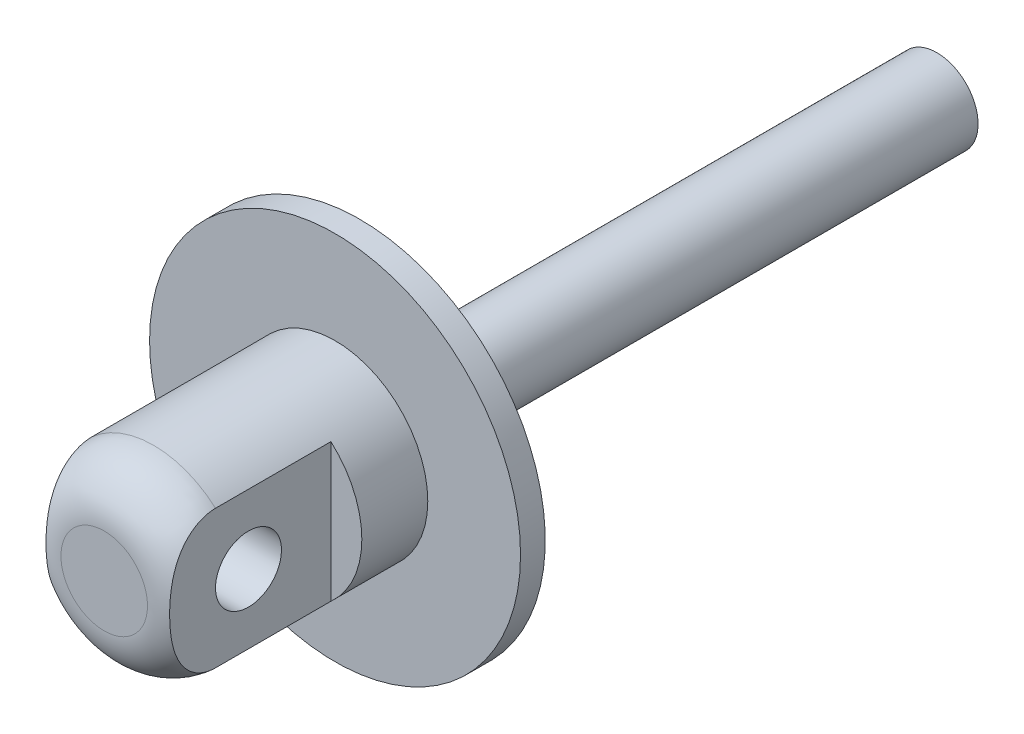
ISO-10303-21;
HEADER;
FILE_DESCRIPTION(('STEP AP214'),'2;1');
FILE_NAME('part.step','',(''),(''),'','','');
FILE_SCHEMA(('AUTOMOTIVE_DESIGN { 1 0 10303 214 1 1 1 1 }'));
ENDSEC;
DATA;
#1=APPLICATION_CONTEXT('core data for automotive mechanical design processes');
#2=APPLICATION_PROTOCOL_DEFINITION('international standard','automotive_design',2000,#1);
#3=PRODUCT_CONTEXT('',#1,'mechanical');
#4=PRODUCT('Part','Part','',(#3));
#5=PRODUCT_RELATED_PRODUCT_CATEGORY('part','',(#4));
#6=PRODUCT_DEFINITION_FORMATION('','',#4);
#7=PRODUCT_DEFINITION_CONTEXT('part definition',#1,'design');
#8=PRODUCT_DEFINITION('design','',#6,#7);
#9=PRODUCT_DEFINITION_SHAPE('','',#8);
#10=(LENGTH_UNIT() NAMED_UNIT(*) SI_UNIT(.MILLI.,.METRE.));
#11=(NAMED_UNIT(*) PLANE_ANGLE_UNIT() SI_UNIT($,.RADIAN.));
#12=(NAMED_UNIT(*) SI_UNIT($,.STERADIAN.) SOLID_ANGLE_UNIT());
#13=UNCERTAINTY_MEASURE_WITH_UNIT(LENGTH_MEASURE(1.E-05),#10,'distance_accuracy_value','');
#14=(GEOMETRIC_REPRESENTATION_CONTEXT(3) GLOBAL_UNCERTAINTY_ASSIGNED_CONTEXT((#13)) GLOBAL_UNIT_ASSIGNED_CONTEXT((#10,
#11,#12)) REPRESENTATION_CONTEXT('',''));
#15=CARTESIAN_POINT('',(0.,0.,0.));
#16=DIRECTION('',(0.,0.,1.));
#17=DIRECTION('',(1.,0.,0.));
#18=AXIS2_PLACEMENT_3D('',#15,#16,#17);
#19=CARTESIAN_POINT('',(0.,0.,101.));
#20=DIRECTION('',(0.,0.,-1.));
#21=DIRECTION('',(-1.,0.,0.));
#22=AXIS2_PLACEMENT_3D('',#19,#20,#21);
#23=CYLINDRICAL_SURFACE('',#22,22.5);
#24=CARTESIAN_POINT('',(0.,0.,70.));
#25=DIRECTION('',(0.,0.,-1.));
#26=DIRECTION('',(-1.,0.,0.));
#27=AXIS2_PLACEMENT_3D('',#24,#25,#26);
#28=CIRCLE('',#27,22.5);
#29=CARTESIAN_POINT('',(-22.5,0.,70.));
#30=VERTEX_POINT('',#29);
#31=EDGE_CURVE('E118',#30,#30,#28,.T.);
#32=ORIENTED_EDGE('',*,*,#31,.F.);
#33=EDGE_LOOP('',(#32));
#34=FACE_BOUND('',#33,.T.);
#35=CARTESIAN_POINT('',(0.,0.,73.));
#36=DIRECTION('',(0.,0.,1.));
#37=DIRECTION('',(1.,0.,0.));
#38=AXIS2_PLACEMENT_3D('',#35,#36,#37);
#39=CIRCLE('',#38,22.5);
#40=CARTESIAN_POINT('',(22.5,0.,73.));
#41=VERTEX_POINT('',#40);
#42=EDGE_CURVE('E111',#41,#41,#39,.T.);
#43=ORIENTED_EDGE('',*,*,#42,.F.);
#44=EDGE_LOOP('',(#43));
#45=FACE_BOUND('',#44,.T.);
#46=ADVANCED_FACE('F39',(#34,#45),#23,.T.);
#47=CARTESIAN_POINT('',(0.,0.,70.));
#48=DIRECTION('',(0.,0.,-1.));
#49=DIRECTION('',(-1.,0.,0.));
#50=AXIS2_PLACEMENT_3D('',#47,#48,#49);
#51=PLANE('',#50);
#52=CARTESIAN_POINT('',(0.,0.,70.));
#53=DIRECTION('',(0.,0.,-1.));
#54=DIRECTION('',(-1.,0.,0.));
#55=AXIS2_PLACEMENT_3D('',#52,#53,#54);
#56=CIRCLE('',#55,5.);
#57=CARTESIAN_POINT('',(-5.,0.,70.));
#58=VERTEX_POINT('',#57);
#59=EDGE_CURVE('E115',#58,#58,#56,.T.);
#60=ORIENTED_EDGE('',*,*,#59,.F.);
#61=EDGE_LOOP('',(#60));
#62=FACE_BOUND('',#61,.T.);
#63=ORIENTED_EDGE('',*,*,#31,.T.);
#64=EDGE_LOOP('',(#63));
#65=FACE_BOUND('',#64,.T.);
#66=ADVANCED_FACE('F155',(#62,#65),#51,.T.);
#67=CARTESIAN_POINT('',(0.,0.,70.));
#68=DIRECTION('',(0.,0.,-1.));
#69=DIRECTION('',(-1.,0.,0.));
#70=AXIS2_PLACEMENT_3D('',#67,#68,#69);
#71=CYLINDRICAL_SURFACE('',#70,5.);
#72=ORIENTED_EDGE('',*,*,#59,.T.);
#73=EDGE_LOOP('',(#72));
#74=FACE_BOUND('',#73,.T.);
#75=CARTESIAN_POINT('',(0.,0.,0.));
#76=DIRECTION('',(0.,0.,-1.));
#77=DIRECTION('',(-1.,0.,0.));
#78=AXIS2_PLACEMENT_3D('',#75,#76,#77);
#79=CIRCLE('',#78,5.);
#80=CARTESIAN_POINT('',(-5.,0.,0.));
#81=VERTEX_POINT('',#80);
#82=EDGE_CURVE('E114',#81,#81,#79,.T.);
#83=ORIENTED_EDGE('',*,*,#82,.F.);
#84=EDGE_LOOP('',(#83));
#85=FACE_BOUND('',#84,.T.);
#86=ADVANCED_FACE('F152',(#74,#85),#71,.T.);
#87=CARTESIAN_POINT('',(0.,0.,0.));
#88=DIRECTION('',(0.,0.,1.));
#89=DIRECTION('',(1.,0.,0.));
#90=AXIS2_PLACEMENT_3D('',#87,#88,#89);
#91=PLANE('',#90);
#92=ORIENTED_EDGE('',*,*,#82,.T.);
#93=EDGE_LOOP('',(#92));
#94=FACE_BOUND('',#93,.T.);
#95=ADVANCED_FACE('F150',(#94),#91,.F.);
#96=CARTESIAN_POINT('',(0.,0.,73.));
#97=DIRECTION('',(0.,0.,1.));
#98=DIRECTION('',(1.,0.,0.));
#99=AXIS2_PLACEMENT_3D('',#96,#97,#98);
#100=PLANE('',#99);
#101=CARTESIAN_POINT('',(0.,0.,73.));
#102=DIRECTION('',(0.,0.,1.));
#103=DIRECTION('',(1.,0.,0.));
#104=AXIS2_PLACEMENT_3D('',#101,#102,#103);
#105=CIRCLE('',#104,11.25);
#106=CARTESIAN_POINT('',(11.25,0.,73.));
#107=VERTEX_POINT('',#106);
#108=EDGE_CURVE('E108',#107,#107,#105,.T.);
#109=ORIENTED_EDGE('',*,*,#108,.F.);
#110=EDGE_LOOP('',(#109));
#111=FACE_BOUND('',#110,.T.);
#112=ORIENTED_EDGE('',*,*,#42,.T.);
#113=EDGE_LOOP('',(#112));
#114=FACE_BOUND('',#113,.T.);
#115=ADVANCED_FACE('F147',(#111,#114),#100,.T.);
#116=CARTESIAN_POINT('',(0.,0.,73.));
#117=DIRECTION('',(0.,0.,1.));
#118=DIRECTION('',(1.,0.,0.));
#119=AXIS2_PLACEMENT_3D('',#116,#117,#118);
#120=CYLINDRICAL_SURFACE('',#119,11.25);
#121=DIRECTION('',(0.,0.,1.));
#122=VECTOR('',#121,1.);
#123=CARTESIAN_POINT('',(-7.5,8.38525491562421,73.));
#124=LINE('',#123,#122);
#125=CARTESIAN_POINT('',(-7.5,8.3852549156243,94.9999999999999));
#126=VERTEX_POINT('',#125);
#127=CARTESIAN_POINT('',(-7.5,8.38525491562421,81.));
#128=VERTEX_POINT('',#127);
#129=EDGE_CURVE('E106',#126,#128,#124,.F.);
#130=ORIENTED_EDGE('',*,*,#129,.F.);
#131=CARTESIAN_POINT('',(0.,0.,95.));
#132=DIRECTION('',(0.,0.,1.));
#133=DIRECTION('',(1.,0.,0.));
#134=AXIS2_PLACEMENT_3D('',#131,#132,#133);
#135=CIRCLE('',#134,11.25);
#136=CARTESIAN_POINT('',(7.5,8.38525491562421,95.));
#137=VERTEX_POINT('',#136);
#138=EDGE_CURVE('E99',#126,#137,#135,.F.);
#139=ORIENTED_EDGE('',*,*,#138,.T.);
#140=DIRECTION('',(0.,0.,1.));
#141=VECTOR('',#140,1.);
#142=CARTESIAN_POINT('',(7.5,8.38525491562421,73.));
#143=LINE('',#142,#141);
#144=CARTESIAN_POINT('',(7.5,8.38525491562421,81.));
#145=VERTEX_POINT('',#144);
#146=EDGE_CURVE('E56',#145,#137,#143,.T.);
#147=ORIENTED_EDGE('',*,*,#146,.F.);
#148=CARTESIAN_POINT('',(0.,0.,81.));
#149=DIRECTION('',(0.,0.,-1.));
#150=DIRECTION('',(-1.,0.,0.));
#151=AXIS2_PLACEMENT_3D('',#148,#149,#150);
#152=CIRCLE('',#151,11.25);
#153=CARTESIAN_POINT('',(7.50000000000001,-8.38525491562421,81.));
#154=VERTEX_POINT('',#153);
#155=EDGE_CURVE('E49',#154,#145,#152,.F.);
#156=ORIENTED_EDGE('',*,*,#155,.F.);
#157=DIRECTION('',(0.,0.,1.));
#158=VECTOR('',#157,1.);
#159=CARTESIAN_POINT('',(7.50000000000001,-8.38525491562421,73.));
#160=LINE('',#159,#158);
#161=CARTESIAN_POINT('',(7.50000000000001,-8.3852549156243,94.9999999999999));
#162=VERTEX_POINT('',#161);
#163=EDGE_CURVE('E91',#162,#154,#160,.F.);
#164=ORIENTED_EDGE('',*,*,#163,.F.);
#165=CARTESIAN_POINT('',(-7.5,-8.38525491562421,95.));
#166=VERTEX_POINT('',#165);
#167=EDGE_CURVE('E126',#162,#166,#135,.F.);
#168=ORIENTED_EDGE('',*,*,#167,.T.);
#169=DIRECTION('',(0.,0.,1.));
#170=VECTOR('',#169,1.);
#171=CARTESIAN_POINT('',(-7.5,-8.38525491562421,73.));
#172=LINE('',#171,#170);
#173=CARTESIAN_POINT('',(-7.5,-8.38525491562421,81.));
#174=VERTEX_POINT('',#173);
#175=EDGE_CURVE('E64',#174,#166,#172,.T.);
#176=ORIENTED_EDGE('',*,*,#175,.F.);
#177=CARTESIAN_POINT('',(0.,0.,81.));
#178=DIRECTION('',(0.,0.,1.));
#179=DIRECTION('',(1.,0.,0.));
#180=AXIS2_PLACEMENT_3D('',#177,#178,#179);
#181=CIRCLE('',#180,11.25);
#182=EDGE_CURVE('E11',#174,#128,#181,.F.);
#183=ORIENTED_EDGE('',*,*,#182,.T.);
#184=EDGE_LOOP('',(#130,#139,#147,#156,#164,#168,#176,#183));
#185=FACE_BOUND('',#184,.T.);
#186=ORIENTED_EDGE('',*,*,#108,.T.);
#187=EDGE_LOOP('',(#186));
#188=FACE_BOUND('',#187,.T.);
#189=ADVANCED_FACE('F96',(#185,#188),#120,.T.);
#190=CARTESIAN_POINT('',(0.,0.,101.));
#191=DIRECTION('',(0.,0.,1.));
#192=DIRECTION('',(1.,0.,0.));
#193=AXIS2_PLACEMENT_3D('',#190,#191,#192);
#194=PLANE('',#193);
#195=CARTESIAN_POINT('',(0.,0.,101.));
#196=DIRECTION('',(0.,0.,1.));
#197=DIRECTION('',(1.,0.,0.));
#198=AXIS2_PLACEMENT_3D('',#195,#196,#197);
#199=CIRCLE('',#198,5.25);
#200=CARTESIAN_POINT('',(5.25,0.,101.));
#201=VERTEX_POINT('',#200);
#202=EDGE_CURVE('E123',#201,#201,#199,.T.);
#203=ORIENTED_EDGE('',*,*,#202,.T.);
#204=EDGE_LOOP('',(#203));
#205=FACE_BOUND('',#204,.T.);
#206=ADVANCED_FACE('F146',(#205),#194,.T.);
#207=CARTESIAN_POINT('',(0.,0.,95.));
#208=DIRECTION('',(0.,0.,1.));
#209=DIRECTION('',(1.,0.,0.));
#210=AXIS2_PLACEMENT_3D('',#207,#208,#209);
#211=DEGENERATE_TOROIDAL_SURFACE('',#210,5.25,6.,.T.);
#212=CARTESIAN_POINT('',(-7.5,0.,100.562148865322));
#213=CARTESIAN_POINT('',(-7.5,0.164189019990902,100.562145614841));
#214=CARTESIAN_POINT('',(-7.5,0.328372486423925,100.559973378696));
#215=CARTESIAN_POINT('',(-7.5,0.656627265334217,100.551201269905));
#216=CARTESIAN_POINT('',(-7.5,0.820698575998209,100.544601327293));
#217=CARTESIAN_POINT('',(-7.5,1.1486468262588,100.52675380707));
#218=CARTESIAN_POINT('',(-7.5,1.31252368567589,100.515504724629));
#219=CARTESIAN_POINT('',(-7.5,1.6398554572701,100.487997481592));
#220=CARTESIAN_POINT('',(-7.5,1.80331035213332,100.471739118651));
#221=CARTESIAN_POINT('',(-7.5,2.29175938686725,100.41487160018));
#222=CARTESIAN_POINT('',(-7.5,2.61588264756811,100.366118755556));
#223=CARTESIAN_POINT('',(-7.5,3.2588173179616,100.242126366605));
#224=CARTESIAN_POINT('',(-7.5,3.57763302000548,100.166909435147));
#225=CARTESIAN_POINT('',(-7.5,4.23603998930151,99.9756958219862));
#226=CARTESIAN_POINT('',(-7.5,4.57475444049857,99.8565218767773));
#227=CARTESIAN_POINT('',(-7.5,5.06829960048401,99.6439615522642));
#228=CARTESIAN_POINT('',(-7.5,5.23046687048265,99.5674306444914));
#229=CARTESIAN_POINT('',(-7.5,5.54859002345835,99.4024492770321));
#230=CARTESIAN_POINT('',(-7.5,5.70454845959773,99.3140037837778));
#231=CARTESIAN_POINT('',(-7.5,6.01062237816506,99.123551285862));
#232=CARTESIAN_POINT('',(-7.5,6.1606439768984,99.0213927208312));
#233=CARTESIAN_POINT('',(-7.5,6.45096958294488,98.8041915397136));
#234=CARTESIAN_POINT('',(-7.5,6.59127866439164,98.6891557345938));
#235=CARTESIAN_POINT('',(-7.5,6.86023271353424,98.4463537359576));
#236=CARTESIAN_POINT('',(-7.5,6.98888870499407,98.3185998190833));
#237=CARTESIAN_POINT('',(-7.5,7.23263129233829,98.0508394234999));
#238=CARTESIAN_POINT('',(-7.5,7.3477227409073,97.9108373579588));
#239=CARTESIAN_POINT('',(-7.5,7.61419073399971,97.5490216958382));
#240=CARTESIAN_POINT('',(-7.5,7.75635391307374,97.3202753636124));
#241=CARTESIAN_POINT('',(-7.5,8.00042456502334,96.8422986176253));
#242=CARTESIAN_POINT('',(-7.5,8.10235096650471,96.59307790246));
#243=CARTESIAN_POINT('',(-7.5,8.26149810334816,96.0797413983651));
#244=CARTESIAN_POINT('',(-7.5,8.3185715971506,95.8155795779201));
#245=CARTESIAN_POINT('',(-7.5,8.38448085212744,95.281284023902));
#246=CARTESIAN_POINT('',(-7.5,8.39332234387718,95.0111510036128));
#247=CARTESIAN_POINT('',(-7.5,8.36324587269025,94.4893700901679));
#248=CARTESIAN_POINT('',(-7.5,8.32706956757516,94.237559159166));
#249=CARTESIAN_POINT('',(-7.5,8.21325096456949,93.7435702336642));
#250=CARTESIAN_POINT('',(-7.5,8.13561404859865,93.5013909932767));
#251=CARTESIAN_POINT('',(-7.5,7.9414965888607,93.03087787684));
#252=CARTESIAN_POINT('',(-7.5,7.82469916673477,92.802675517634));
#253=CARTESIAN_POINT('',(-7.5,7.55722088662209,92.3671407243551));
#254=CARTESIAN_POINT('',(-7.5,7.40652904224299,92.1598150887886));
#255=CARTESIAN_POINT('',(-7.5,7.06307249767575,91.7530542355968));
#256=CARTESIAN_POINT('',(-7.5,6.86785441427993,91.5557008311617));
#257=CARTESIAN_POINT('',(-7.5,6.4512427847553,91.1910997423688));
#258=CARTESIAN_POINT('',(-7.5,6.22984389446749,91.0238582222374));
#259=CARTESIAN_POINT('',(-7.5,5.82331385872649,90.7560507199056));
#260=CARTESIAN_POINT('',(-7.5,5.64229678382582,90.6491286037174));
#261=CARTESIAN_POINT('',(-7.5,5.27146176582727,90.451759601475));
#262=CARTESIAN_POINT('',(-7.5,5.08163995761043,90.3613200384958));
#263=CARTESIAN_POINT('',(-7.5,4.50148763865432,90.1129088864335));
#264=CARTESIAN_POINT('',(-7.5,4.101044671332,89.9782080049966));
#265=CARTESIAN_POINT('',(-7.5,3.51747406042826,89.8218494328596));
#266=CARTESIAN_POINT('',(-7.5,3.33935657065318,89.7793158856219));
#267=CARTESIAN_POINT('',(-7.5,2.98126481383961,89.702942430861));
#268=CARTESIAN_POINT('',(-7.5,2.8012910121565,89.6691003970488));
#269=CARTESIAN_POINT('',(-7.5,2.43989070916085,89.6091739481793));
#270=CARTESIAN_POINT('',(-7.5,2.25846286588919,89.583097825792));
#271=CARTESIAN_POINT('',(-7.5,1.89474907005483,89.5379178002149));
#272=CARTESIAN_POINT('',(-7.5,1.71246312770429,89.5188138142619));
#273=CARTESIAN_POINT('',(-7.5,1.34665130820012,89.4868325322415));
#274=CARTESIAN_POINT('',(-7.5,1.16312335533482,89.4739793361326));
#275=CARTESIAN_POINT('',(-7.5,0.795759438953638,89.4540977109543));
#276=CARTESIAN_POINT('',(-7.5,0.611923479920832,89.447069197831));
#277=CARTESIAN_POINT('',(-7.5,0.244209121419214,89.438539504482));
#278=CARTESIAN_POINT('',(-7.5,0.0603307812320591,89.4370357608242));
#279=CARTESIAN_POINT('',(-7.5,-0.30738625869008,89.4394896839592));
#280=CARTESIAN_POINT('',(-7.5,-0.491224957989974,89.4434474079203));
#281=CARTESIAN_POINT('',(-7.5,-0.981357235268532,89.4614833442288));
#282=CARTESIAN_POINT('',(-7.5,-1.28748810610653,89.4805532342397));
#283=CARTESIAN_POINT('',(-7.5,-1.89823798661537,89.5364147775158));
#284=CARTESIAN_POINT('',(-7.5,-2.2028567022061,89.5732097512393));
#285=CARTESIAN_POINT('',(-7.5,-2.80729870680781,89.6678404964301));
#286=CARTESIAN_POINT('',(-7.5,-3.10713855762887,89.7255676431236));
#287=CARTESIAN_POINT('',(-7.5,-3.70089132219802,89.8664035783026));
#288=CARTESIAN_POINT('',(-7.5,-3.99480647444011,89.9495025815366));
#289=CARTESIAN_POINT('',(-7.5,-4.45627191526443,90.1060285377643));
#290=CARTESIAN_POINT('',(-7.5,-4.62708140273487,90.169892906979));
#291=CARTESIAN_POINT('',(-7.5,-4.96390677483259,90.3090944790512));
#292=CARTESIAN_POINT('',(-7.5,-5.12992492179648,90.3844261583363));
#293=CARTESIAN_POINT('',(-7.5,-5.45588484955697,90.547313708139));
#294=CARTESIAN_POINT('',(-7.5,-5.61582650951974,90.6348698215835));
#295=CARTESIAN_POINT('',(-7.5,-5.92805066036049,90.8227408486685));
#296=CARTESIAN_POINT('',(-7.5,-6.08033434129721,90.9230537712827));
#297=CARTESIAN_POINT('',(-7.5,-6.35190448750724,91.1196413537591));
#298=CARTESIAN_POINT('',(-7.5,-6.47257668212401,91.214002410334));
#299=CARTESIAN_POINT('',(-7.5,-6.70613029678767,91.4119061205593));
#300=CARTESIAN_POINT('',(-7.5,-6.81901328855409,91.5154469122149));
#301=CARTESIAN_POINT('',(-7.5,-7.03585423461626,91.7315646855056));
#302=CARTESIAN_POINT('',(-7.5,-7.13980980521249,91.8441440650927));
#303=CARTESIAN_POINT('',(-7.5,-7.33750434441383,92.0778656870145));
#304=CARTESIAN_POINT('',(-7.5,-7.43124845856967,92.1990035655138));
#305=CARTESIAN_POINT('',(-7.5,-7.60809458697087,92.4502926252514));
#306=CARTESIAN_POINT('',(-7.5,-7.69110513834616,92.5805083501799));
#307=CARTESIAN_POINT('',(-7.5,-7.84439292776033,92.8481645254083));
#308=CARTESIAN_POINT('',(-7.5,-7.91467628509888,92.9856014624829));
#309=CARTESIAN_POINT('',(-7.5,-8.04149015511168,93.2666529243603));
#310=CARTESIAN_POINT('',(-7.5,-8.09802394213057,93.4102659687693));
#311=CARTESIAN_POINT('',(-7.5,-8.19645791501223,93.7024179281931));
#312=CARTESIAN_POINT('',(-7.5,-8.23836030248015,93.8509560984318));
#313=CARTESIAN_POINT('',(-7.5,-8.30239786558441,94.1319759501696));
#314=CARTESIAN_POINT('',(-7.5,-8.32639393107285,94.2640364519176));
#315=CARTESIAN_POINT('',(-7.5,-8.36248935332499,94.5297700111308));
#316=CARTESIAN_POINT('',(-7.5,-8.37458977568818,94.6634429230719));
#317=CARTESIAN_POINT('',(-7.5,-8.38673463892912,94.9312832658235));
#318=CARTESIAN_POINT('',(-7.5,-8.38678364856389,95.0654504899471));
#319=CARTESIAN_POINT('',(-7.5,-8.37483656628666,95.3332469683191));
#320=CARTESIAN_POINT('',(-7.5,-8.36284069553736,95.4668762324));
#321=CARTESIAN_POINT('',(-7.5,-8.32802023381419,95.7246941099316));
#322=CARTESIAN_POINT('',(-7.5,-8.30587511432108,95.8489751672492));
#323=CARTESIAN_POINT('',(-7.5,-8.25130222454112,96.0952993095888));
#324=CARTESIAN_POINT('',(-7.5,-8.21887115866612,96.2173416640614));
#325=CARTESIAN_POINT('',(-7.5,-8.14410537660234,96.4582911329761));
#326=CARTESIAN_POINT('',(-7.5,-8.10177496586484,96.5771995854783));
#327=CARTESIAN_POINT('',(-7.5,-8.00764302829837,96.8112505050002));
#328=CARTESIAN_POINT('',(-7.5,-7.95583793827506,96.9263915359149));
#329=CARTESIAN_POINT('',(-7.5,-7.84191083493718,97.1550023322007));
#330=CARTESIAN_POINT('',(-7.5,-7.77956635069223,97.2683612820949));
#331=CARTESIAN_POINT('',(-7.5,-7.64614360676528,97.489835538695));
#332=CARTESIAN_POINT('',(-7.5,-7.57506220944211,97.5979489420409));
#333=CARTESIAN_POINT('',(-7.5,-7.34975166829239,97.9136137357989));
#334=CARTESIAN_POINT('',(-7.5,-7.18337949184802,98.1126415190447));
#335=CARTESIAN_POINT('',(-7.5,-6.80636458848373,98.503604234048));
#336=CARTESIAN_POINT('',(-7.5,-6.59295990059606,98.6928454416478));
#337=CARTESIAN_POINT('',(-7.5,-6.14172838846501,99.0394432038326));
#338=CARTESIAN_POINT('',(-7.5,-5.90389080322802,99.1967856177154));
#339=CARTESIAN_POINT('',(-7.5,-5.46061010462404,99.4517929978391));
#340=CARTESIAN_POINT('',(-7.5,-5.25834812589983,99.5550913676247));
#341=CARTESIAN_POINT('',(-7.5,-4.84539479890681,99.7432987825237));
#342=CARTESIAN_POINT('',(-7.5,-4.63469910535659,99.828198199669));
#343=CARTESIAN_POINT('',(-7.5,-3.99291486191668,100.057846137754));
#344=CARTESIAN_POINT('',(-7.5,-3.5526686119709,100.177249467179));
#345=CARTESIAN_POINT('',(-7.5,-2.85253385670755,100.323127880758));
#346=CARTESIAN_POINT('',(-7.5,-2.59593311647367,100.36751120686));
#347=CARTESIAN_POINT('',(-7.5,-2.08052396663202,100.441479993355));
#348=CARTESIAN_POINT('',(-7.5,-1.82171525699367,100.471063409002));
#349=CARTESIAN_POINT('',(-7.5,-1.30266273387959,100.517518327467));
#350=CARTESIAN_POINT('',(-7.5,-1.0424174503302,100.534372539342));
#351=CARTESIAN_POINT('',(-7.5,-0.5214434381434,100.55669029351));
#352=CARTESIAN_POINT('',(-7.5,-0.260714717683116,100.562154026739));
#353=CARTESIAN_POINT('',(-7.5,0.,100.562148865322));
#354=B_SPLINE_CURVE_WITH_KNOTS('',3,(#212,#213,#214,#215,#216,#217,#218,#219,#220,#221,#222,
#223,#224,#225,#226,#227,#228,#229,#230,#231,#232,#233,#234,#235,#236,#237,#238,#239,#240,#241,
#242,#243,#244,#245,#246,#247,#248,#249,#250,#251,#252,#253,#254,#255,#256,#257,#258,#259,#260,
#261,#262,#263,#264,#265,#266,#267,#268,#269,#270,#271,#272,#273,#274,#275,#276,#277,#278,#279,
#280,#281,#282,#283,#284,#285,#286,#287,#288,#289,#290,#291,#292,#293,#294,#295,#296,#297,#298,
#299,#300,#301,#302,#303,#304,#305,#306,#307,#308,#309,#310,#311,#312,#313,#314,#315,#316,#317,
#318,#319,#320,#321,#322,#323,#324,#325,#326,#327,#328,#329,#330,#331,#332,#333,#334,#335,#336,
#337,#338,#339,#340,#341,#342,#343,#344,#345,#346,#347,#348,#349,#350,#351,#352,#353),
.UNSPECIFIED.,.T.,.F.,(4,2,2,2,2,2,2,2,2,2,2,2,2,2,2,2,2,2,2,2,2,2,2,2,2,2,2,2,2,2,2,2,2,2,2,2,
2,2,2,2,2,2,2,2,2,2,2,2,2,2,2,2,2,2,2,2,2,2,2,2,2,2,2,2,2,2,2,2,2,2,4),(0.,0.492542286291293,
0.985092355825993,1.47780197837868,1.97053150611185,2.95285793120435,3.93434701448376,
5.00841262192395,5.54595445732028,6.08327291510475,6.62711247397602,7.170665734995,
7.71369930640121,8.25653801526729,9.06076505818721,9.86461331606715,10.6710895224737,
11.4774699071615,12.2370568970641,12.9965453104436,13.7623339316142,14.5283711308394,
15.3579648282033,16.1877281597057,16.8175712115457,17.4476934193512,18.7099516483037,
19.2592384907188,19.8083908275161,20.3581274800225,20.9078576066199,21.4596907413379,
22.0115159126171,22.5630850107359,23.1146598824899,24.0343699669765,24.9542524087416,
25.8694280017348,26.7842510806898,27.3309693822784,27.8774251691246,28.42389181682,
28.9702732788648,29.4293952010926,29.8884242083012,30.3475754016437,30.8064941479401,
31.269096580042,31.7314759965319,32.1937451931943,32.6559448016227,33.058094773878,
33.4602087186688,33.8621702196108,34.264124340051,34.6424019290925,35.0208008398476,
35.3990354813382,35.7774126611877,36.1650991367167,36.5529252490647,37.3280727460442,
38.1806384362803,39.0335812455535,39.7139608424498,40.3946956193241,41.75798709509,
42.5389380884001,43.3199969475708,44.1021148732969,44.8842196883725),.UNSPECIFIED.);
#355=EDGE_CURVE('E88',#166,#126,#354,.T.);
#356=ORIENTED_EDGE('',*,*,#355,.F.);
#357=ORIENTED_EDGE('',*,*,#167,.F.);
#358=CARTESIAN_POINT('',(7.5,0.,100.562148865322));
#359=CARTESIAN_POINT('',(7.5,-0.164189019990903,100.562145614841));
#360=CARTESIAN_POINT('',(7.5,-0.328372486423926,100.559973378696));
#361=CARTESIAN_POINT('',(7.5,-0.656627265334218,100.551201269905));
#362=CARTESIAN_POINT('',(7.5,-0.820698575998211,100.544601327293));
#363=CARTESIAN_POINT('',(7.5,-1.1486468262588,100.52675380707));
#364=CARTESIAN_POINT('',(7.5,-1.31252368567589,100.515504724629));
#365=CARTESIAN_POINT('',(7.5,-1.6398554572701,100.487997481592));
#366=CARTESIAN_POINT('',(7.5,-1.80331035213333,100.471739118651));
#367=CARTESIAN_POINT('',(7.5,-2.29175938686726,100.41487160018));
#368=CARTESIAN_POINT('',(7.5,-2.61588264756811,100.366118755556));
#369=CARTESIAN_POINT('',(7.5,-3.2588173179616,100.242126366605));
#370=CARTESIAN_POINT('',(7.5,-3.57763302000549,100.166909435147));
#371=CARTESIAN_POINT('',(7.5,-4.23603998930151,99.9756958219862));
#372=CARTESIAN_POINT('',(7.50000000000001,-4.57475444049857,99.8565218767773));
#373=CARTESIAN_POINT('',(7.50000000000001,-5.06829960048402,99.6439615522642));
#374=CARTESIAN_POINT('',(7.50000000000001,-5.23046687048266,99.5674306444914));
#375=CARTESIAN_POINT('',(7.50000000000001,-5.54859002345837,99.4024492770321));
#376=CARTESIAN_POINT('',(7.50000000000001,-5.70454845959774,99.3140037837778));
#377=CARTESIAN_POINT('',(7.50000000000001,-6.01062237816507,99.1235512858619));
#378=CARTESIAN_POINT('',(7.50000000000001,-6.16064397689841,99.0213927208312));
#379=CARTESIAN_POINT('',(7.50000000000001,-6.45096958294489,98.8041915397136));
#380=CARTESIAN_POINT('',(7.50000000000001,-6.59127866439165,98.6891557345938));
#381=CARTESIAN_POINT('',(7.50000000000001,-6.86023271353425,98.4463537359576));
#382=CARTESIAN_POINT('',(7.50000000000001,-6.98888870499408,98.3185998190833));
#383=CARTESIAN_POINT('',(7.50000000000001,-7.23263129233829,98.0508394234999));
#384=CARTESIAN_POINT('',(7.50000000000001,-7.34772274090731,97.9108373579588));
#385=CARTESIAN_POINT('',(7.50000000000001,-7.61419073399972,97.5490216958382));
#386=CARTESIAN_POINT('',(7.50000000000001,-7.75635391307375,97.3202753636124));
#387=CARTESIAN_POINT('',(7.50000000000001,-8.00042456502334,96.8422986176253));
#388=CARTESIAN_POINT('',(7.50000000000001,-8.1023509665047,96.59307790246));
#389=CARTESIAN_POINT('',(7.50000000000001,-8.26149810334816,96.0797413983651));
#390=CARTESIAN_POINT('',(7.50000000000001,-8.3185715971506,95.8155795779201));
#391=CARTESIAN_POINT('',(7.50000000000001,-8.38448085212744,95.281284023902));
#392=CARTESIAN_POINT('',(7.50000000000001,-8.39332234387718,95.0111510036128));
#393=CARTESIAN_POINT('',(7.50000000000001,-8.36324587269025,94.4893700901679));
#394=CARTESIAN_POINT('',(7.50000000000001,-8.32706956757515,94.2375591591661));
#395=CARTESIAN_POINT('',(7.50000000000001,-8.21325096456949,93.7435702336642));
#396=CARTESIAN_POINT('',(7.50000000000001,-8.13561404859865,93.5013909932767));
#397=CARTESIAN_POINT('',(7.50000000000001,-7.94149658886069,93.03087787684));
#398=CARTESIAN_POINT('',(7.50000000000001,-7.82469916673477,92.802675517634));
#399=CARTESIAN_POINT('',(7.50000000000001,-7.55722088662208,92.3671407243551));
#400=CARTESIAN_POINT('',(7.50000000000001,-7.40652904224298,92.1598150887886));
#401=CARTESIAN_POINT('',(7.50000000000001,-7.06307249767574,91.7530542355968));
#402=CARTESIAN_POINT('',(7.50000000000001,-6.86785441427992,91.5557008311617));
#403=CARTESIAN_POINT('',(7.50000000000001,-6.4512427847553,91.1910997423688));
#404=CARTESIAN_POINT('',(7.50000000000001,-6.22984389446748,91.0238582222374));
#405=CARTESIAN_POINT('',(7.50000000000001,-5.82331385872649,90.7560507199056));
#406=CARTESIAN_POINT('',(7.50000000000001,-5.64229678382581,90.6491286037174));
#407=CARTESIAN_POINT('',(7.50000000000001,-5.27146176582725,90.451759601475));
#408=CARTESIAN_POINT('',(7.50000000000001,-5.08163995761042,90.3613200384958));
#409=CARTESIAN_POINT('',(7.50000000000001,-4.50148763865431,90.1129088864335));
#410=CARTESIAN_POINT('',(7.5,-4.10104467133199,89.9782080049966));
#411=CARTESIAN_POINT('',(7.5,-3.51747406042825,89.8218494328596));
#412=CARTESIAN_POINT('',(7.5,-3.33935657065318,89.7793158856219));
#413=CARTESIAN_POINT('',(7.5,-2.9812648138396,89.702942430861));
#414=CARTESIAN_POINT('',(7.5,-2.80129101215649,89.6691003970488));
#415=CARTESIAN_POINT('',(7.5,-2.43989070916084,89.6091739481793));
#416=CARTESIAN_POINT('',(7.5,-2.25846286588918,89.583097825792));
#417=CARTESIAN_POINT('',(7.5,-1.89474907005482,89.537917800215));
#418=CARTESIAN_POINT('',(7.5,-1.71246312770428,89.5188138142619));
#419=CARTESIAN_POINT('',(7.5,-1.34665130820011,89.4868325322415));
#420=CARTESIAN_POINT('',(7.5,-1.16312335533481,89.4739793361326));
#421=CARTESIAN_POINT('',(7.5,-0.795759438953623,89.4540977109543));
#422=CARTESIAN_POINT('',(7.5,-0.611923479920817,89.447069197831));
#423=CARTESIAN_POINT('',(7.5,-0.244209121419201,89.438539504482));
#424=CARTESIAN_POINT('',(7.5,-0.0603307812320454,89.4370357608242));
#425=CARTESIAN_POINT('',(7.5,0.307386258690094,89.4394896839592));
#426=CARTESIAN_POINT('',(7.5,0.491224957989988,89.4434474079203));
#427=CARTESIAN_POINT('',(7.5,0.981357235268542,89.4614833442287));
#428=CARTESIAN_POINT('',(7.5,1.28748810610654,89.4805532342397));
#429=CARTESIAN_POINT('',(7.5,1.89823798661538,89.5364147775158));
#430=CARTESIAN_POINT('',(7.5,2.20285670220611,89.5732097512393));
#431=CARTESIAN_POINT('',(7.5,2.80729870680781,89.6678404964301));
#432=CARTESIAN_POINT('',(7.5,3.10713855762887,89.7255676431236));
#433=CARTESIAN_POINT('',(7.5,3.70089132219801,89.8664035783026));
#434=CARTESIAN_POINT('',(7.5,3.99480647444011,89.9495025815366));
#435=CARTESIAN_POINT('',(7.5,4.45627191526443,90.1060285377643));
#436=CARTESIAN_POINT('',(7.5,4.62708140273487,90.169892906979));
#437=CARTESIAN_POINT('',(7.5,4.96390677483259,90.3090944790512));
#438=CARTESIAN_POINT('',(7.5,5.12992492179649,90.3844261583363));
#439=CARTESIAN_POINT('',(7.5,5.45588484955697,90.547313708139));
#440=CARTESIAN_POINT('',(7.5,5.61582650951974,90.6348698215835));
#441=CARTESIAN_POINT('',(7.5,5.92805066036049,90.8227408486685));
#442=CARTESIAN_POINT('',(7.5,6.08033434129721,90.9230537712827));
#443=CARTESIAN_POINT('',(7.5,6.35190448750724,91.1196413537591));
#444=CARTESIAN_POINT('',(7.5,6.472576682124,91.214002410334));
#445=CARTESIAN_POINT('',(7.5,6.70613029678767,91.4119061205593));
#446=CARTESIAN_POINT('',(7.5,6.81901328855408,91.5154469122149));
#447=CARTESIAN_POINT('',(7.5,7.03585423461625,91.7315646855056));
#448=CARTESIAN_POINT('',(7.5,7.13980980521248,91.8441440650927));
#449=CARTESIAN_POINT('',(7.5,7.33750434441383,92.0778656870145));
#450=CARTESIAN_POINT('',(7.5,7.43124845856967,92.1990035655138));
#451=CARTESIAN_POINT('',(7.5,7.60809458697086,92.4502926252514));
#452=CARTESIAN_POINT('',(7.5,7.69110513834616,92.5805083501799));
#453=CARTESIAN_POINT('',(7.5,7.84439292776032,92.8481645254083));
#454=CARTESIAN_POINT('',(7.5,7.91467628509888,92.9856014624829));
#455=CARTESIAN_POINT('',(7.5,8.04149015511168,93.2666529243603));
#456=CARTESIAN_POINT('',(7.5,8.09802394213057,93.4102659687693));
#457=CARTESIAN_POINT('',(7.5,8.19645791501223,93.7024179281931));
#458=CARTESIAN_POINT('',(7.5,8.23836030248015,93.8509560984318));
#459=CARTESIAN_POINT('',(7.5,8.30239786558441,94.1319759501696));
#460=CARTESIAN_POINT('',(7.5,8.32639393107285,94.2640364519176));
#461=CARTESIAN_POINT('',(7.5,8.36248935332499,94.5297700111308));
#462=CARTESIAN_POINT('',(7.5,8.37458977568818,94.6634429230719));
#463=CARTESIAN_POINT('',(7.5,8.38673463892912,94.9312832658235));
#464=CARTESIAN_POINT('',(7.5,8.38678364856389,95.0654504899471));
#465=CARTESIAN_POINT('',(7.5,8.37483656628666,95.3332469683191));
#466=CARTESIAN_POINT('',(7.5,8.36284069553736,95.4668762324));
#467=CARTESIAN_POINT('',(7.5,8.32802023381419,95.7246941099316));
#468=CARTESIAN_POINT('',(7.5,8.30587511432108,95.8489751672492));
#469=CARTESIAN_POINT('',(7.5,8.25130222454112,96.0952993095888));
#470=CARTESIAN_POINT('',(7.5,8.21887115866612,96.2173416640614));
#471=CARTESIAN_POINT('',(7.5,8.14410537660233,96.4582911329761));
#472=CARTESIAN_POINT('',(7.5,8.10177496586484,96.5771995854783));
#473=CARTESIAN_POINT('',(7.5,8.00764302829837,96.8112505050002));
#474=CARTESIAN_POINT('',(7.5,7.95583793827506,96.9263915359149));
#475=CARTESIAN_POINT('',(7.5,7.84191083493718,97.1550023322007));
#476=CARTESIAN_POINT('',(7.5,7.77956635069222,97.2683612820949));
#477=CARTESIAN_POINT('',(7.5,7.64614360676527,97.4898355386951));
#478=CARTESIAN_POINT('',(7.5,7.5750622094421,97.5979489420409));
#479=CARTESIAN_POINT('',(7.5,7.34975166829239,97.9136137357989));
#480=CARTESIAN_POINT('',(7.5,7.18337949184801,98.1126415190447));
#481=CARTESIAN_POINT('',(7.5,6.80636458848373,98.503604234048));
#482=CARTESIAN_POINT('',(7.5,6.59295990059606,98.6928454416478));
#483=CARTESIAN_POINT('',(7.5,6.141728388465,99.0394432038326));
#484=CARTESIAN_POINT('',(7.5,5.90389080322802,99.1967856177154));
#485=CARTESIAN_POINT('',(7.5,5.46061010462404,99.4517929978391));
#486=CARTESIAN_POINT('',(7.5,5.25834812589983,99.5550913676247));
#487=CARTESIAN_POINT('',(7.5,4.84539479890681,99.7432987825237));
#488=CARTESIAN_POINT('',(7.5,4.63469910535659,99.828198199669));
#489=CARTESIAN_POINT('',(7.5,3.99291486191668,100.057846137754));
#490=CARTESIAN_POINT('',(7.5,3.5526686119709,100.177249467179));
#491=CARTESIAN_POINT('',(7.5,2.85253385670755,100.323127880758));
#492=CARTESIAN_POINT('',(7.5,2.59593311647367,100.36751120686));
#493=CARTESIAN_POINT('',(7.5,2.08052396663203,100.441479993355));
#494=CARTESIAN_POINT('',(7.5,1.82171525699367,100.471063409002));
#495=CARTESIAN_POINT('',(7.5,1.30266273387959,100.517518327467));
#496=CARTESIAN_POINT('',(7.5,1.0424174503302,100.534372539342));
#497=CARTESIAN_POINT('',(7.5,0.5214434381434,100.55669029351));
#498=CARTESIAN_POINT('',(7.5,0.260714717683115,100.562154026739));
#499=CARTESIAN_POINT('',(7.5,0.,100.562148865322));
#500=B_SPLINE_CURVE_WITH_KNOTS('',3,(#358,#359,#360,#361,#362,#363,#364,#365,#366,#367,#368,
#369,#370,#371,#372,#373,#374,#375,#376,#377,#378,#379,#380,#381,#382,#383,#384,#385,#386,#387,
#388,#389,#390,#391,#392,#393,#394,#395,#396,#397,#398,#399,#400,#401,#402,#403,#404,#405,#406,
#407,#408,#409,#410,#411,#412,#413,#414,#415,#416,#417,#418,#419,#420,#421,#422,#423,#424,#425,
#426,#427,#428,#429,#430,#431,#432,#433,#434,#435,#436,#437,#438,#439,#440,#441,#442,#443,#444,
#445,#446,#447,#448,#449,#450,#451,#452,#453,#454,#455,#456,#457,#458,#459,#460,#461,#462,#463,
#464,#465,#466,#467,#468,#469,#470,#471,#472,#473,#474,#475,#476,#477,#478,#479,#480,#481,#482,
#483,#484,#485,#486,#487,#488,#489,#490,#491,#492,#493,#494,#495,#496,#497,#498,#499),
.UNSPECIFIED.,.T.,.F.,(4,2,2,2,2,2,2,2,2,2,2,2,2,2,2,2,2,2,2,2,2,2,2,2,2,2,2,2,2,2,2,2,2,2,2,2,
2,2,2,2,2,2,2,2,2,2,2,2,2,2,2,2,2,2,2,2,2,2,2,2,2,2,2,2,2,2,2,2,2,2,4),(0.,0.492542286291294,
0.985092355825994,1.47780197837868,1.97053150611185,2.95285793120436,3.93434701448376,
5.00841262192396,5.5459544573203,6.08327291510476,6.62711247397602,7.17066573499501,
7.71369930640121,8.2565380152673,9.06076505818723,9.86461331606715,10.6710895224737,
11.4774699071615,12.2370568970641,12.9965453104436,13.7623339316142,14.5283711308394,
15.3579648282033,16.1877281597056,16.8175712115457,17.4476934193512,18.7099516483037,
19.2592384907188,19.8083908275161,20.3581274800225,20.9078576066199,21.4596907413379,
22.0115159126172,22.5630850107359,23.1146598824899,24.0343699669765,24.9542524087416,
25.8694280017348,26.7842510806898,27.3309693822784,27.8774251691246,28.42389181682,
28.9702732788648,29.4293952010926,29.8884242083011,30.3475754016436,30.8064941479401,
31.2690965800419,31.7314759965319,32.1937451931943,32.6559448016227,33.058094773878,
33.4602087186688,33.8621702196108,34.2641243400509,34.6424019290925,35.0208008398476,
35.3990354813382,35.7774126611877,36.1650991367167,36.5529252490647,37.3280727460442,
38.1806384362803,39.0335812455535,39.7139608424498,40.394695619324,41.75798709509,
42.5389380884001,43.3199969475708,44.1021148732969,44.8842196883725),.UNSPECIFIED.);
#501=EDGE_CURVE('E129',#137,#162,#500,.T.);
#502=ORIENTED_EDGE('',*,*,#501,.F.);
#503=ORIENTED_EDGE('',*,*,#138,.F.);
#504=EDGE_LOOP('',(#356,#357,#502,#503));
#505=FACE_BOUND('',#504,.T.);
#506=ORIENTED_EDGE('',*,*,#202,.F.);
#507=EDGE_LOOP('',(#506));
#508=FACE_BOUND('',#507,.T.);
#509=ADVANCED_FACE('F41',(#505,#508),#211,.T.);
#510=CARTESIAN_POINT('',(7.50000000000001,-11.5281827016524,81.));
#511=DIRECTION('',(-1.,0.,0.));
#512=DIRECTION('',(0.,-1.,0.));
#513=AXIS2_PLACEMENT_3D('',#510,#511,#512);
#514=PLANE('',#513);
#515=CARTESIAN_POINT('',(7.5,0.,91.));
#516=DIRECTION('',(1.,0.,0.));
#517=DIRECTION('',(0.,1.,0.));
#518=AXIS2_PLACEMENT_3D('',#515,#516,#517);
#519=CIRCLE('',#518,4.00000000000001);
#520=CARTESIAN_POINT('',(7.5,4.00000000000001,91.));
#521=VERTEX_POINT('',#520);
#522=EDGE_CURVE('E286',#521,#521,#519,.T.);
#523=ORIENTED_EDGE('',*,*,#522,.F.);
#524=EDGE_LOOP('',(#523));
#525=FACE_BOUND('',#524,.T.);
#526=ORIENTED_EDGE('',*,*,#163,.T.);
#527=DIRECTION('',(0.,-1.,0.));
#528=VECTOR('',#527,1.);
#529=CARTESIAN_POINT('',(7.50000000000001,-11.5281827016524,81.));
#530=LINE('',#529,#528);
#531=EDGE_CURVE('E85',#145,#154,#530,.T.);
#532=ORIENTED_EDGE('',*,*,#531,.F.);
#533=ORIENTED_EDGE('',*,*,#146,.T.);
#534=ORIENTED_EDGE('',*,*,#501,.T.);
#535=EDGE_LOOP('',(#526,#532,#533,#534));
#536=FACE_BOUND('',#535,.T.);
#537=ADVANCED_FACE('F90',(#525,#536),#514,.F.);
#538=CARTESIAN_POINT('',(0.,0.,81.));
#539=DIRECTION('',(0.,0.,-1.));
#540=DIRECTION('',(-1.,0.,0.));
#541=AXIS2_PLACEMENT_3D('',#538,#539,#540);
#542=PLANE('',#541);
#543=ORIENTED_EDGE('',*,*,#155,.T.);
#544=ORIENTED_EDGE('',*,*,#531,.T.);
#545=EDGE_LOOP('',(#543,#544));
#546=FACE_BOUND('',#545,.T.);
#547=ADVANCED_FACE('F84',(#546),#542,.F.);
#548=CARTESIAN_POINT('',(-7.5,-11.5281827016524,81.));
#549=DIRECTION('',(1.,0.,0.));
#550=DIRECTION('',(0.,0.,-1.));
#551=AXIS2_PLACEMENT_3D('',#548,#549,#550);
#552=PLANE('',#551);
#553=CARTESIAN_POINT('',(-7.5,0.,91.));
#554=DIRECTION('',(1.,0.,0.));
#555=DIRECTION('',(0.,0.,-1.));
#556=AXIS2_PLACEMENT_3D('',#553,#554,#555);
#557=CIRCLE('',#556,4.00000000000001);
#558=CARTESIAN_POINT('',(-7.5,0.,87.));
#559=VERTEX_POINT('',#558);
#560=EDGE_CURVE('E44',#559,#559,#557,.T.);
#561=ORIENTED_EDGE('',*,*,#560,.T.);
#562=EDGE_LOOP('',(#561));
#563=FACE_BOUND('',#562,.T.);
#564=ORIENTED_EDGE('',*,*,#129,.T.);
#565=DIRECTION('',(0.,1.,0.));
#566=VECTOR('',#565,1.);
#567=CARTESIAN_POINT('',(-7.5,-11.5281827016524,81.));
#568=LINE('',#567,#566);
#569=EDGE_CURVE('E92',#174,#128,#568,.T.);
#570=ORIENTED_EDGE('',*,*,#569,.F.);
#571=ORIENTED_EDGE('',*,*,#175,.T.);
#572=ORIENTED_EDGE('',*,*,#355,.T.);
#573=EDGE_LOOP('',(#564,#570,#571,#572));
#574=FACE_BOUND('',#573,.T.);
#575=ADVANCED_FACE('F215',(#563,#574),#552,.F.);
#576=CARTESIAN_POINT('',(0.,0.,81.));
#577=DIRECTION('',(0.,0.,1.));
#578=DIRECTION('',(1.,0.,0.));
#579=AXIS2_PLACEMENT_3D('',#576,#577,#578);
#580=PLANE('',#579);
#581=ORIENTED_EDGE('',*,*,#569,.T.);
#582=ORIENTED_EDGE('',*,*,#182,.F.);
#583=EDGE_LOOP('',(#581,#582));
#584=FACE_BOUND('',#583,.T.);
#585=ADVANCED_FACE('F221',(#584),#580,.T.);
#586=CARTESIAN_POINT('',(-22.5,0.,91.));
#587=DIRECTION('',(1.,0.,0.));
#588=DIRECTION('',(0.,1.,0.));
#589=AXIS2_PLACEMENT_3D('',#586,#587,#588);
#590=CYLINDRICAL_SURFACE('',#589,4.00000000000001);
#591=ORIENTED_EDGE('',*,*,#522,.T.);
#592=EDGE_LOOP('',(#591));
#593=FACE_BOUND('',#592,.T.);
#594=ORIENTED_EDGE('',*,*,#560,.F.);
#595=EDGE_LOOP('',(#594));
#596=FACE_BOUND('',#595,.T.);
#597=ADVANCED_FACE('F227',(#593,#596),#590,.F.);
#598=CLOSED_SHELL('',(#46,#66,#86,#95,#115,#189,#206,#509,#537,#547,#575,#585,#597));
#599=MANIFOLD_SOLID_BREP('B2',#598);
#600=ADVANCED_BREP_SHAPE_REPRESENTATION('',(#18,#599),#14);
#601=SHAPE_DEFINITION_REPRESENTATION(#9,#600);
ENDSEC;
END-ISO-10303-21;
